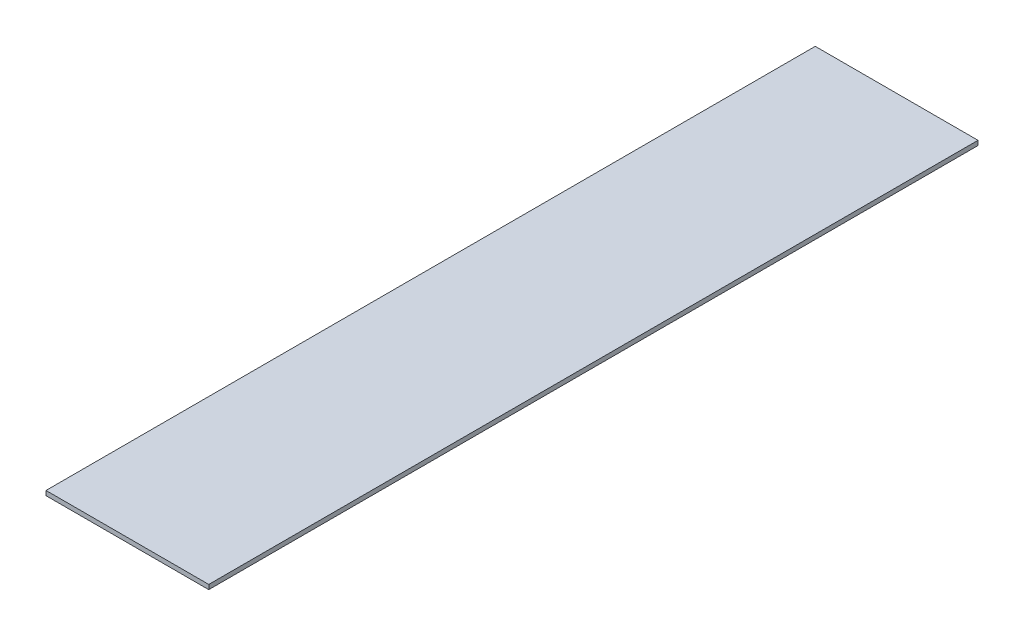
ISO-10303-21;
HEADER;
FILE_DESCRIPTION(('STEP AP214'),'2;1');
FILE_NAME('part.step','',(''),(''),'','','');
FILE_SCHEMA(('AUTOMOTIVE_DESIGN { 1 0 10303 214 1 1 1 1 }'));
ENDSEC;
DATA;
#1=APPLICATION_CONTEXT('core data for automotive mechanical design processes');
#2=APPLICATION_PROTOCOL_DEFINITION('international standard','automotive_design',2000,#1);
#3=PRODUCT_CONTEXT('',#1,'mechanical');
#4=PRODUCT('Part','Part','',(#3));
#5=PRODUCT_RELATED_PRODUCT_CATEGORY('part','',(#4));
#6=PRODUCT_DEFINITION_FORMATION('','',#4);
#7=PRODUCT_DEFINITION_CONTEXT('part definition',#1,'design');
#8=PRODUCT_DEFINITION('design','',#6,#7);
#9=PRODUCT_DEFINITION_SHAPE('','',#8);
#10=(LENGTH_UNIT() NAMED_UNIT(*) SI_UNIT(.MILLI.,.METRE.));
#11=(NAMED_UNIT(*) PLANE_ANGLE_UNIT() SI_UNIT($,.RADIAN.));
#12=(NAMED_UNIT(*) SI_UNIT($,.STERADIAN.) SOLID_ANGLE_UNIT());
#13=UNCERTAINTY_MEASURE_WITH_UNIT(LENGTH_MEASURE(1.E-05),#10,'distance_accuracy_value','');
#14=(GEOMETRIC_REPRESENTATION_CONTEXT(3) GLOBAL_UNCERTAINTY_ASSIGNED_CONTEXT((#13)) GLOBAL_UNIT_ASSIGNED_CONTEXT((#10,
#11,#12)) REPRESENTATION_CONTEXT('',''));
#15=CARTESIAN_POINT('',(0.,0.,0.));
#16=DIRECTION('',(0.,0.,1.));
#17=DIRECTION('',(1.,0.,0.));
#18=AXIS2_PLACEMENT_3D('',#15,#16,#17);
#19=CARTESIAN_POINT('',(-22.375,0.625,211.5));
#20=DIRECTION('',(1.,0.,0.));
#21=DIRECTION('',(0.,0.,-1.));
#22=AXIS2_PLACEMENT_3D('',#19,#20,#21);
#23=PLANE('',#22);
#24=DIRECTION('',(0.,-1.,0.));
#25=VECTOR('',#24,1.);
#26=CARTESIAN_POINT('',(-22.375,0.625,0.));
#27=LINE('',#26,#25);
#28=CARTESIAN_POINT('',(-22.375,0.625,0.));
#29=VERTEX_POINT('',#28);
#30=CARTESIAN_POINT('',(-22.375,-0.625,0.));
#31=VERTEX_POINT('',#30);
#32=EDGE_CURVE('E95',#29,#31,#27,.T.);
#33=ORIENTED_EDGE('',*,*,#32,.T.);
#34=DIRECTION('',(0.,0.,-1.));
#35=VECTOR('',#34,1.);
#36=CARTESIAN_POINT('',(-22.375,-0.625,211.5));
#37=LINE('',#36,#35);
#38=CARTESIAN_POINT('',(-22.375,-0.625,211.5));
#39=VERTEX_POINT('',#38);
#40=EDGE_CURVE('E11',#39,#31,#37,.T.);
#41=ORIENTED_EDGE('',*,*,#40,.F.);
#42=DIRECTION('',(0.,-1.,0.));
#43=VECTOR('',#42,1.);
#44=CARTESIAN_POINT('',(-22.375,0.625,211.5));
#45=LINE('',#44,#43);
#46=CARTESIAN_POINT('',(-22.375,0.625,211.5));
#47=VERTEX_POINT('',#46);
#48=EDGE_CURVE('E81',#47,#39,#45,.T.);
#49=ORIENTED_EDGE('',*,*,#48,.F.);
#50=DIRECTION('',(0.,0.,-1.));
#51=VECTOR('',#50,1.);
#52=CARTESIAN_POINT('',(-22.375,0.625,211.5));
#53=LINE('',#52,#51);
#54=EDGE_CURVE('E48',#47,#29,#53,.T.);
#55=ORIENTED_EDGE('',*,*,#54,.T.);
#56=EDGE_LOOP('',(#33,#41,#49,#55));
#57=FACE_BOUND('',#56,.T.);
#58=ADVANCED_FACE('F32',(#57),#23,.F.);
#59=CARTESIAN_POINT('',(-22.375,-0.625,211.5));
#60=DIRECTION('',(0.,1.,0.));
#61=DIRECTION('',(0.,0.,1.));
#62=AXIS2_PLACEMENT_3D('',#59,#60,#61);
#63=PLANE('',#62);
#64=DIRECTION('',(1.,0.,0.));
#65=VECTOR('',#64,1.);
#66=CARTESIAN_POINT('',(-22.375,-0.625,0.));
#67=LINE('',#66,#65);
#68=CARTESIAN_POINT('',(22.375,-0.625,0.));
#69=VERTEX_POINT('',#68);
#70=EDGE_CURVE('E86',#31,#69,#67,.T.);
#71=ORIENTED_EDGE('',*,*,#70,.T.);
#72=DIRECTION('',(0.,0.,-1.));
#73=VECTOR('',#72,1.);
#74=CARTESIAN_POINT('',(22.375,-0.625,211.5));
#75=LINE('',#74,#73);
#76=CARTESIAN_POINT('',(22.375,-0.625,211.5));
#77=VERTEX_POINT('',#76);
#78=EDGE_CURVE('E40',#77,#69,#75,.T.);
#79=ORIENTED_EDGE('',*,*,#78,.F.);
#80=DIRECTION('',(1.,0.,0.));
#81=VECTOR('',#80,1.);
#82=CARTESIAN_POINT('',(-22.375,-0.625,211.5));
#83=LINE('',#82,#81);
#84=EDGE_CURVE('E73',#39,#77,#83,.T.);
#85=ORIENTED_EDGE('',*,*,#84,.F.);
#86=ORIENTED_EDGE('',*,*,#40,.T.);
#87=EDGE_LOOP('',(#71,#79,#85,#86));
#88=FACE_BOUND('',#87,.T.);
#89=ADVANCED_FACE('F85',(#88),#63,.F.);
#90=CARTESIAN_POINT('',(22.375,0.625,211.5));
#91=DIRECTION('',(1.,0.,0.));
#92=DIRECTION('',(0.,0.,-1.));
#93=AXIS2_PLACEMENT_3D('',#90,#91,#92);
#94=PLANE('',#93);
#95=DIRECTION('',(0.,-1.,0.));
#96=VECTOR('',#95,1.);
#97=CARTESIAN_POINT('',(22.375,0.625,0.));
#98=LINE('',#97,#96);
#99=CARTESIAN_POINT('',(22.375,0.625,0.));
#100=VERTEX_POINT('',#99);
#101=EDGE_CURVE('E98',#100,#69,#98,.T.);
#102=ORIENTED_EDGE('',*,*,#101,.F.);
#103=DIRECTION('',(0.,0.,-1.));
#104=VECTOR('',#103,1.);
#105=CARTESIAN_POINT('',(22.375,0.625,211.5));
#106=LINE('',#105,#104);
#107=CARTESIAN_POINT('',(22.375,0.625,211.5));
#108=VERTEX_POINT('',#107);
#109=EDGE_CURVE('E62',#108,#100,#106,.T.);
#110=ORIENTED_EDGE('',*,*,#109,.F.);
#111=DIRECTION('',(0.,-1.,0.));
#112=VECTOR('',#111,1.);
#113=CARTESIAN_POINT('',(22.375,0.625,211.5));
#114=LINE('',#113,#112);
#115=EDGE_CURVE('E80',#108,#77,#114,.T.);
#116=ORIENTED_EDGE('',*,*,#115,.T.);
#117=ORIENTED_EDGE('',*,*,#78,.T.);
#118=EDGE_LOOP('',(#102,#110,#116,#117));
#119=FACE_BOUND('',#118,.T.);
#120=ADVANCED_FACE('F89',(#119),#94,.T.);
#121=CARTESIAN_POINT('',(-22.375,0.625,211.5));
#122=DIRECTION('',(0.,1.,0.));
#123=DIRECTION('',(0.,0.,1.));
#124=AXIS2_PLACEMENT_3D('',#121,#122,#123);
#125=PLANE('',#124);
#126=DIRECTION('',(1.,0.,0.));
#127=VECTOR('',#126,1.);
#128=CARTESIAN_POINT('',(-22.375,0.625,0.));
#129=LINE('',#128,#127);
#130=EDGE_CURVE('E100',#29,#100,#129,.T.);
#131=ORIENTED_EDGE('',*,*,#130,.F.);
#132=ORIENTED_EDGE('',*,*,#54,.F.);
#133=DIRECTION('',(1.,0.,0.));
#134=VECTOR('',#133,1.);
#135=CARTESIAN_POINT('',(-22.375,0.625,211.5));
#136=LINE('',#135,#134);
#137=EDGE_CURVE('E90',#47,#108,#136,.T.);
#138=ORIENTED_EDGE('',*,*,#137,.T.);
#139=ORIENTED_EDGE('',*,*,#109,.T.);
#140=EDGE_LOOP('',(#131,#132,#138,#139));
#141=FACE_BOUND('',#140,.T.);
#142=ADVANCED_FACE('F106',(#141),#125,.T.);
#143=CARTESIAN_POINT('',(0.,0.,211.5));
#144=DIRECTION('',(0.,0.,1.));
#145=DIRECTION('',(1.,0.,0.));
#146=AXIS2_PLACEMENT_3D('',#143,#144,#145);
#147=PLANE('',#146);
#148=ORIENTED_EDGE('',*,*,#48,.T.);
#149=ORIENTED_EDGE('',*,*,#84,.T.);
#150=ORIENTED_EDGE('',*,*,#115,.F.);
#151=ORIENTED_EDGE('',*,*,#137,.F.);
#152=EDGE_LOOP('',(#148,#149,#150,#151));
#153=FACE_BOUND('',#152,.T.);
#154=ADVANCED_FACE('F77',(#153),#147,.T.);
#155=CARTESIAN_POINT('',(0.,0.,0.));
#156=DIRECTION('',(0.,0.,1.));
#157=DIRECTION('',(1.,0.,0.));
#158=AXIS2_PLACEMENT_3D('',#155,#156,#157);
#159=PLANE('',#158);
#160=ORIENTED_EDGE('',*,*,#32,.F.);
#161=ORIENTED_EDGE('',*,*,#130,.T.);
#162=ORIENTED_EDGE('',*,*,#101,.T.);
#163=ORIENTED_EDGE('',*,*,#70,.F.);
#164=EDGE_LOOP('',(#160,#161,#162,#163));
#165=FACE_BOUND('',#164,.T.);
#166=ADVANCED_FACE('F105',(#165),#159,.F.);
#167=CLOSED_SHELL('',(#58,#89,#120,#142,#154,#166));
#168=MANIFOLD_SOLID_BREP('B2',#167);
#169=ADVANCED_BREP_SHAPE_REPRESENTATION('',(#18,#168),#14);
#170=SHAPE_DEFINITION_REPRESENTATION(#9,#169);
ENDSEC;
END-ISO-10303-21;
